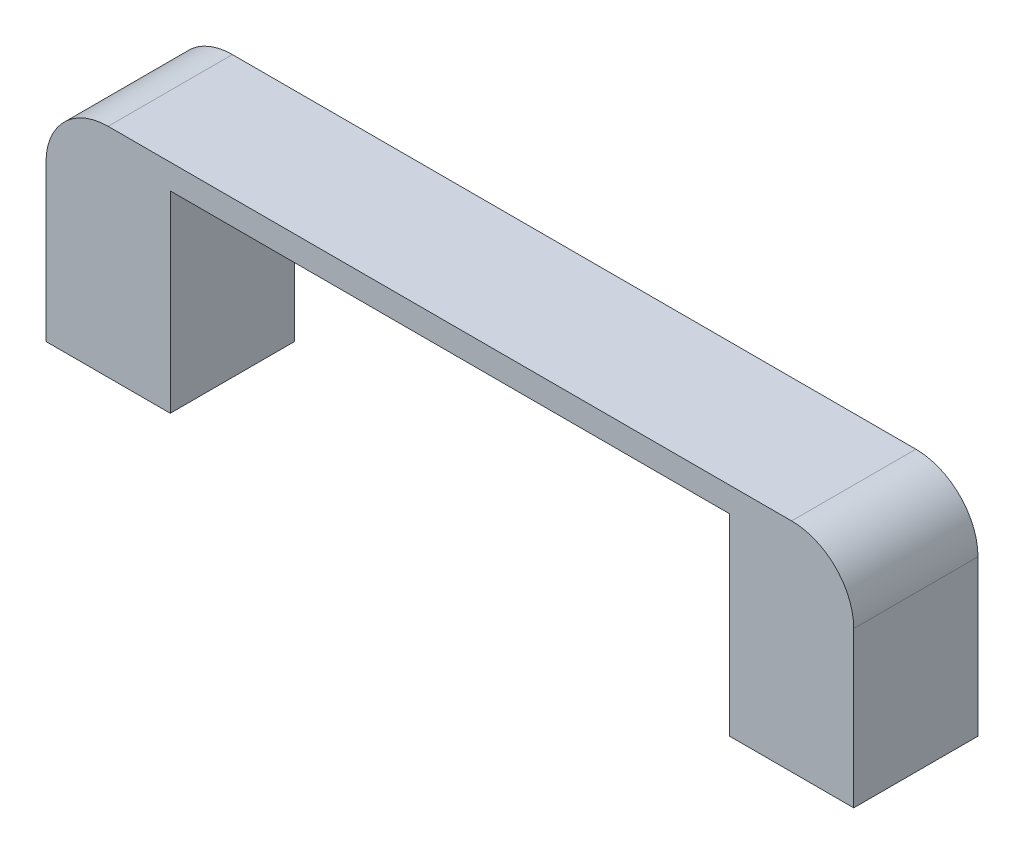
ISO-10303-21;
HEADER;
FILE_DESCRIPTION(('STEP AP214'),'2;1');
FILE_NAME('part.step','',(''),(''),'','','');
FILE_SCHEMA(('AUTOMOTIVE_DESIGN { 1 0 10303 214 1 1 1 1 }'));
ENDSEC;
DATA;
#1=APPLICATION_CONTEXT('core data for automotive mechanical design processes');
#2=APPLICATION_PROTOCOL_DEFINITION('international standard','automotive_design',2000,#1);
#3=PRODUCT_CONTEXT('',#1,'mechanical');
#4=PRODUCT('Part','Part','',(#3));
#5=PRODUCT_RELATED_PRODUCT_CATEGORY('part','',(#4));
#6=PRODUCT_DEFINITION_FORMATION('','',#4);
#7=PRODUCT_DEFINITION_CONTEXT('part definition',#1,'design');
#8=PRODUCT_DEFINITION('design','',#6,#7);
#9=PRODUCT_DEFINITION_SHAPE('','',#8);
#10=(LENGTH_UNIT() NAMED_UNIT(*) SI_UNIT(.MILLI.,.METRE.));
#11=(NAMED_UNIT(*) PLANE_ANGLE_UNIT() SI_UNIT($,.RADIAN.));
#12=(NAMED_UNIT(*) SI_UNIT($,.STERADIAN.) SOLID_ANGLE_UNIT());
#13=UNCERTAINTY_MEASURE_WITH_UNIT(LENGTH_MEASURE(1.E-05),#10,'distance_accuracy_value','');
#14=(GEOMETRIC_REPRESENTATION_CONTEXT(3) GLOBAL_UNCERTAINTY_ASSIGNED_CONTEXT((#13)) GLOBAL_UNIT_ASSIGNED_CONTEXT((#10,
#11,#12)) REPRESENTATION_CONTEXT('',''));
#15=CARTESIAN_POINT('',(0.,0.,0.));
#16=DIRECTION('',(0.,0.,1.));
#17=DIRECTION('',(1.,0.,0.));
#18=AXIS2_PLACEMENT_3D('',#15,#16,#17);
#19=CARTESIAN_POINT('',(0.,15.5,0.));
#20=DIRECTION('',(0.,-1.,0.));
#21=DIRECTION('',(0.,0.,-1.));
#22=AXIS2_PLACEMENT_3D('',#19,#20,#21);
#23=PLANE('',#22);
#24=DIRECTION('',(1.,0.,0.));
#25=VECTOR('',#24,1.);
#26=CARTESIAN_POINT('',(32.5,15.5,0.));
#27=LINE('',#26,#25);
#28=CARTESIAN_POINT('',(-22.5,15.5,0.));
#29=VERTEX_POINT('',#28);
#30=CARTESIAN_POINT('',(22.5,15.5,0.));
#31=VERTEX_POINT('',#30);
#32=EDGE_CURVE('E146',#29,#31,#27,.T.);
#33=ORIENTED_EDGE('',*,*,#32,.F.);
#34=DIRECTION('',(0.,0.,-1.));
#35=VECTOR('',#34,1.);
#36=CARTESIAN_POINT('',(-22.5,15.5,0.));
#37=LINE('',#36,#35);
#38=CARTESIAN_POINT('',(-22.5,15.5,-9.99999999999999));
#39=VERTEX_POINT('',#38);
#40=EDGE_CURVE('E140',#29,#39,#37,.T.);
#41=ORIENTED_EDGE('',*,*,#40,.T.);
#42=DIRECTION('',(-1.,0.,0.));
#43=VECTOR('',#42,1.);
#44=CARTESIAN_POINT('',(-32.5,15.5,-9.99999999999999));
#45=LINE('',#44,#43);
#46=CARTESIAN_POINT('',(22.5,15.5,-9.99999999999999));
#47=VERTEX_POINT('',#46);
#48=EDGE_CURVE('E150',#47,#39,#45,.T.);
#49=ORIENTED_EDGE('',*,*,#48,.F.);
#50=DIRECTION('',(0.,0.,1.));
#51=VECTOR('',#50,1.);
#52=CARTESIAN_POINT('',(22.5,15.5,0.));
#53=LINE('',#52,#51);
#54=EDGE_CURVE('E172',#47,#31,#53,.T.);
#55=ORIENTED_EDGE('',*,*,#54,.T.);
#56=EDGE_LOOP('',(#33,#41,#49,#55));
#57=FACE_BOUND('',#56,.T.);
#58=ADVANCED_FACE('F43',(#57),#23,.T.);
#59=CARTESIAN_POINT('',(32.5,15.5,0.));
#60=DIRECTION('',(0.,0.,-1.));
#61=DIRECTION('',(-1.,0.,0.));
#62=AXIS2_PLACEMENT_3D('',#59,#60,#61);
#63=PLANE('',#62);
#64=DIRECTION('',(0.,-1.,0.));
#65=VECTOR('',#64,1.);
#66=CARTESIAN_POINT('',(32.5,15.5,0.));
#67=LINE('',#66,#65);
#68=CARTESIAN_POINT('',(32.5,12.5,0.));
#69=VERTEX_POINT('',#68);
#70=CARTESIAN_POINT('',(32.5,0.,0.));
#71=VERTEX_POINT('',#70);
#72=EDGE_CURVE('E200',#69,#71,#67,.T.);
#73=ORIENTED_EDGE('',*,*,#72,.F.);
#74=CARTESIAN_POINT('',(27.5,12.5,0.));
#75=DIRECTION('',(0.,0.,-1.));
#76=DIRECTION('',(-1.,0.,0.));
#77=AXIS2_PLACEMENT_3D('',#74,#75,#76);
#78=CIRCLE('',#77,5.);
#79=CARTESIAN_POINT('',(27.5,17.5,0.));
#80=VERTEX_POINT('',#79);
#81=EDGE_CURVE('E52',#69,#80,#78,.F.);
#82=ORIENTED_EDGE('',*,*,#81,.T.);
#83=DIRECTION('',(1.,0.,0.));
#84=VECTOR('',#83,1.);
#85=CARTESIAN_POINT('',(32.5,17.5,0.));
#86=LINE('',#85,#84);
#87=CARTESIAN_POINT('',(-27.5,17.5,0.));
#88=VERTEX_POINT('',#87);
#89=EDGE_CURVE('E159',#88,#80,#86,.T.);
#90=ORIENTED_EDGE('',*,*,#89,.F.);
#91=CARTESIAN_POINT('',(-27.5,12.5,0.));
#92=DIRECTION('',(0.,0.,-1.));
#93=DIRECTION('',(-1.,0.,0.));
#94=AXIS2_PLACEMENT_3D('',#91,#92,#93);
#95=CIRCLE('',#94,5.);
#96=CARTESIAN_POINT('',(-32.5,12.5,0.));
#97=VERTEX_POINT('',#96);
#98=EDGE_CURVE('E59',#88,#97,#95,.F.);
#99=ORIENTED_EDGE('',*,*,#98,.T.);
#100=DIRECTION('',(0.,-1.,0.));
#101=VECTOR('',#100,1.);
#102=CARTESIAN_POINT('',(-32.5,17.5,0.));
#103=LINE('',#102,#101);
#104=CARTESIAN_POINT('',(-32.5,0.,0.));
#105=VERTEX_POINT('',#104);
#106=EDGE_CURVE('E119',#97,#105,#103,.T.);
#107=ORIENTED_EDGE('',*,*,#106,.T.);
#108=DIRECTION('',(1.,0.,0.));
#109=VECTOR('',#108,1.);
#110=CARTESIAN_POINT('',(-32.5,0.,0.));
#111=LINE('',#110,#109);
#112=CARTESIAN_POINT('',(-22.5,0.,0.));
#113=VERTEX_POINT('',#112);
#114=EDGE_CURVE('E124',#105,#113,#111,.T.);
#115=ORIENTED_EDGE('',*,*,#114,.T.);
#116=DIRECTION('',(0.,-1.,0.));
#117=VECTOR('',#116,1.);
#118=CARTESIAN_POINT('',(-22.5,15.5,0.));
#119=LINE('',#118,#117);
#120=EDGE_CURVE('E248',#29,#113,#119,.T.);
#121=ORIENTED_EDGE('',*,*,#120,.F.);
#122=ORIENTED_EDGE('',*,*,#32,.T.);
#123=DIRECTION('',(0.,-1.,0.));
#124=VECTOR('',#123,1.);
#125=CARTESIAN_POINT('',(22.5,15.5,0.));
#126=LINE('',#125,#124);
#127=CARTESIAN_POINT('',(22.5,0.,0.));
#128=VERTEX_POINT('',#127);
#129=EDGE_CURVE('E176',#31,#128,#126,.T.);
#130=ORIENTED_EDGE('',*,*,#129,.T.);
#131=DIRECTION('',(1.,0.,0.));
#132=VECTOR('',#131,1.);
#133=CARTESIAN_POINT('',(32.5,0.,0.));
#134=LINE('',#133,#132);
#135=EDGE_CURVE('E128',#128,#71,#134,.T.);
#136=ORIENTED_EDGE('',*,*,#135,.T.);
#137=EDGE_LOOP('',(#73,#82,#90,#99,#107,#115,#121,#122,#130,#136));
#138=FACE_BOUND('',#137,.T.);
#139=ADVANCED_FACE('F121',(#138),#63,.F.);
#140=CARTESIAN_POINT('',(32.5,15.5,-9.99999999999999));
#141=DIRECTION('',(-1.,0.,0.));
#142=DIRECTION('',(0.,0.,1.));
#143=AXIS2_PLACEMENT_3D('',#140,#141,#142);
#144=PLANE('',#143);
#145=DIRECTION('',(0.,-1.,0.));
#146=VECTOR('',#145,1.);
#147=CARTESIAN_POINT('',(32.5,15.5,-9.99999999999999));
#148=LINE('',#147,#146);
#149=CARTESIAN_POINT('',(32.5,12.5,-9.99999999999999));
#150=VERTEX_POINT('',#149);
#151=CARTESIAN_POINT('',(32.5,0.,-9.99999999999999));
#152=VERTEX_POINT('',#151);
#153=EDGE_CURVE('E197',#150,#152,#148,.T.);
#154=ORIENTED_EDGE('',*,*,#153,.F.);
#155=DIRECTION('',(0.,0.,-1.));
#156=VECTOR('',#155,1.);
#157=CARTESIAN_POINT('',(32.5,12.5,-9.99999999999999));
#158=LINE('',#157,#156);
#159=EDGE_CURVE('E67',#150,#69,#158,.F.);
#160=ORIENTED_EDGE('',*,*,#159,.T.);
#161=ORIENTED_EDGE('',*,*,#72,.T.);
#162=DIRECTION('',(0.,0.,-1.));
#163=VECTOR('',#162,1.);
#164=CARTESIAN_POINT('',(32.5,0.,-9.99999999999999));
#165=LINE('',#164,#163);
#166=EDGE_CURVE('E181',#71,#152,#165,.T.);
#167=ORIENTED_EDGE('',*,*,#166,.T.);
#168=EDGE_LOOP('',(#154,#160,#161,#167));
#169=FACE_BOUND('',#168,.T.);
#170=ADVANCED_FACE('F231',(#169),#144,.F.);
#171=CARTESIAN_POINT('',(22.5,15.5,-9.99999999999999));
#172=DIRECTION('',(0.,0.,1.));
#173=DIRECTION('',(1.,0.,0.));
#174=AXIS2_PLACEMENT_3D('',#171,#172,#173);
#175=PLANE('',#174);
#176=DIRECTION('',(-1.,0.,0.));
#177=VECTOR('',#176,1.);
#178=CARTESIAN_POINT('',(-32.5,17.5,-9.99999999999999));
#179=LINE('',#178,#177);
#180=CARTESIAN_POINT('',(27.5,17.5,-9.99999999999999));
#181=VERTEX_POINT('',#180);
#182=CARTESIAN_POINT('',(-27.5,17.5,-9.99999999999999));
#183=VERTEX_POINT('',#182);
#184=EDGE_CURVE('E163',#181,#183,#179,.T.);
#185=ORIENTED_EDGE('',*,*,#184,.F.);
#186=CARTESIAN_POINT('',(27.5,12.5,-9.99999999999999));
#187=DIRECTION('',(0.,0.,1.));
#188=DIRECTION('',(1.,0.,0.));
#189=AXIS2_PLACEMENT_3D('',#186,#187,#188);
#190=CIRCLE('',#189,5.);
#191=EDGE_CURVE('E214',#181,#150,#190,.F.);
#192=ORIENTED_EDGE('',*,*,#191,.T.);
#193=ORIENTED_EDGE('',*,*,#153,.T.);
#194=DIRECTION('',(-1.,0.,0.));
#195=VECTOR('',#194,1.);
#196=CARTESIAN_POINT('',(22.5,0.,-9.99999999999999));
#197=LINE('',#196,#195);
#198=CARTESIAN_POINT('',(22.5,0.,-9.99999999999999));
#199=VERTEX_POINT('',#198);
#200=EDGE_CURVE('E185',#152,#199,#197,.T.);
#201=ORIENTED_EDGE('',*,*,#200,.T.);
#202=DIRECTION('',(0.,-1.,0.));
#203=VECTOR('',#202,1.);
#204=CARTESIAN_POINT('',(22.5,15.5,-9.99999999999999));
#205=LINE('',#204,#203);
#206=EDGE_CURVE('E193',#47,#199,#205,.T.);
#207=ORIENTED_EDGE('',*,*,#206,.F.);
#208=ORIENTED_EDGE('',*,*,#48,.T.);
#209=DIRECTION('',(0.,-1.,0.));
#210=VECTOR('',#209,1.);
#211=CARTESIAN_POINT('',(-22.5,15.5,-9.99999999999999));
#212=LINE('',#211,#210);
#213=CARTESIAN_POINT('',(-22.5,0.,-9.99999999999999));
#214=VERTEX_POINT('',#213);
#215=EDGE_CURVE('E158',#39,#214,#212,.T.);
#216=ORIENTED_EDGE('',*,*,#215,.T.);
#217=DIRECTION('',(-1.,0.,0.));
#218=VECTOR('',#217,1.);
#219=CARTESIAN_POINT('',(-22.5,0.,-9.99999999999999));
#220=LINE('',#219,#218);
#221=CARTESIAN_POINT('',(-32.5,0.,-9.99999999999999));
#222=VERTEX_POINT('',#221);
#223=EDGE_CURVE('E139',#214,#222,#220,.T.);
#224=ORIENTED_EDGE('',*,*,#223,.T.);
#225=DIRECTION('',(0.,-1.,0.));
#226=VECTOR('',#225,1.);
#227=CARTESIAN_POINT('',(-32.5,17.5,-9.99999999999999));
#228=LINE('',#227,#226);
#229=CARTESIAN_POINT('',(-32.5,12.5,-9.99999999999999));
#230=VERTEX_POINT('',#229);
#231=EDGE_CURVE('E129',#230,#222,#228,.T.);
#232=ORIENTED_EDGE('',*,*,#231,.F.);
#233=CARTESIAN_POINT('',(-27.5,12.5,-9.99999999999999));
#234=DIRECTION('',(0.,0.,1.));
#235=DIRECTION('',(1.,0.,0.));
#236=AXIS2_PLACEMENT_3D('',#233,#234,#235);
#237=CIRCLE('',#236,5.);
#238=EDGE_CURVE('E211',#230,#183,#237,.F.);
#239=ORIENTED_EDGE('',*,*,#238,.T.);
#240=EDGE_LOOP('',(#185,#192,#193,#201,#207,#208,#216,#224,#232,#239));
#241=FACE_BOUND('',#240,.T.);
#242=ADVANCED_FACE('F230',(#241),#175,.F.);
#243=CARTESIAN_POINT('',(22.5,15.5,0.));
#244=DIRECTION('',(1.,0.,0.));
#245=DIRECTION('',(0.,0.,-1.));
#246=AXIS2_PLACEMENT_3D('',#243,#244,#245);
#247=PLANE('',#246);
#248=DIRECTION('',(0.,0.,1.));
#249=VECTOR('',#248,1.);
#250=CARTESIAN_POINT('',(22.5,0.,0.));
#251=LINE('',#250,#249);
#252=EDGE_CURVE('E177',#199,#128,#251,.T.);
#253=ORIENTED_EDGE('',*,*,#252,.T.);
#254=ORIENTED_EDGE('',*,*,#129,.F.);
#255=ORIENTED_EDGE('',*,*,#54,.F.);
#256=ORIENTED_EDGE('',*,*,#206,.T.);
#257=EDGE_LOOP('',(#253,#254,#255,#256));
#258=FACE_BOUND('',#257,.T.);
#259=ADVANCED_FACE('F240',(#258),#247,.F.);
#260=CARTESIAN_POINT('',(0.,0.,0.));
#261=DIRECTION('',(0.,-1.,0.));
#262=DIRECTION('',(0.,0.,-1.));
#263=AXIS2_PLACEMENT_3D('',#260,#261,#262);
#264=PLANE('',#263);
#265=CARTESIAN_POINT('',(27.5,0.,-5.));
#266=DIRECTION('',(0.,-1.,0.));
#267=DIRECTION('',(0.,0.,-1.));
#268=AXIS2_PLACEMENT_3D('',#265,#266,#267);
#269=CIRCLE('',#268,1.5);
#270=CARTESIAN_POINT('',(27.5,0.,-6.5));
#271=VERTEX_POINT('',#270);
#272=EDGE_CURVE('E259',#271,#271,#269,.T.);
#273=ORIENTED_EDGE('',*,*,#272,.F.);
#274=EDGE_LOOP('',(#273));
#275=FACE_BOUND('',#274,.T.);
#276=ORIENTED_EDGE('',*,*,#135,.F.);
#277=ORIENTED_EDGE('',*,*,#252,.F.);
#278=ORIENTED_EDGE('',*,*,#200,.F.);
#279=ORIENTED_EDGE('',*,*,#166,.F.);
#280=EDGE_LOOP('',(#276,#277,#278,#279));
#281=FACE_BOUND('',#280,.T.);
#282=ADVANCED_FACE('F237',(#275,#281),#264,.T.);
#283=CARTESIAN_POINT('',(-32.5,17.5,0.));
#284=DIRECTION('',(1.,0.,0.));
#285=DIRECTION('',(0.,0.,-1.));
#286=AXIS2_PLACEMENT_3D('',#283,#284,#285);
#287=PLANE('',#286);
#288=ORIENTED_EDGE('',*,*,#106,.F.);
#289=DIRECTION('',(0.,0.,1.));
#290=VECTOR('',#289,1.);
#291=CARTESIAN_POINT('',(-32.5,12.5,0.));
#292=LINE('',#291,#290);
#293=EDGE_CURVE('E11',#97,#230,#292,.F.);
#294=ORIENTED_EDGE('',*,*,#293,.T.);
#295=ORIENTED_EDGE('',*,*,#231,.T.);
#296=DIRECTION('',(0.,0.,1.));
#297=VECTOR('',#296,1.);
#298=CARTESIAN_POINT('',(-32.5,0.,-9.99999999999999));
#299=LINE('',#298,#297);
#300=EDGE_CURVE('E132',#222,#105,#299,.T.);
#301=ORIENTED_EDGE('',*,*,#300,.T.);
#302=EDGE_LOOP('',(#288,#294,#295,#301));
#303=FACE_BOUND('',#302,.T.);
#304=ADVANCED_FACE('F133',(#303),#287,.F.);
#305=CARTESIAN_POINT('',(0.,17.5,0.));
#306=DIRECTION('',(0.,-1.,0.));
#307=DIRECTION('',(0.,0.,-1.));
#308=AXIS2_PLACEMENT_3D('',#305,#306,#307);
#309=PLANE('',#308);
#310=ORIENTED_EDGE('',*,*,#89,.T.);
#311=DIRECTION('',(0.,0.,-1.));
#312=VECTOR('',#311,1.);
#313=CARTESIAN_POINT('',(27.5,17.5,0.));
#314=LINE('',#313,#312);
#315=EDGE_CURVE('E207',#80,#181,#314,.T.);
#316=ORIENTED_EDGE('',*,*,#315,.T.);
#317=ORIENTED_EDGE('',*,*,#184,.T.);
#318=DIRECTION('',(0.,0.,1.));
#319=VECTOR('',#318,1.);
#320=CARTESIAN_POINT('',(-27.5,17.5,0.));
#321=LINE('',#320,#319);
#322=EDGE_CURVE('E203',#183,#88,#321,.T.);
#323=ORIENTED_EDGE('',*,*,#322,.T.);
#324=EDGE_LOOP('',(#310,#316,#317,#323));
#325=FACE_BOUND('',#324,.T.);
#326=ADVANCED_FACE('F225',(#325),#309,.F.);
#327=CARTESIAN_POINT('',(-22.5,15.5,0.));
#328=DIRECTION('',(-1.,0.,0.));
#329=DIRECTION('',(0.,0.,1.));
#330=AXIS2_PLACEMENT_3D('',#327,#328,#329);
#331=PLANE('',#330);
#332=DIRECTION('',(0.,0.,-1.));
#333=VECTOR('',#332,1.);
#334=CARTESIAN_POINT('',(-22.5,0.,0.));
#335=LINE('',#334,#333);
#336=EDGE_CURVE('E143',#113,#214,#335,.T.);
#337=ORIENTED_EDGE('',*,*,#336,.T.);
#338=ORIENTED_EDGE('',*,*,#215,.F.);
#339=ORIENTED_EDGE('',*,*,#40,.F.);
#340=ORIENTED_EDGE('',*,*,#120,.T.);
#341=EDGE_LOOP('',(#337,#338,#339,#340));
#342=FACE_BOUND('',#341,.T.);
#343=ADVANCED_FACE('F280',(#342),#331,.F.);
#344=CARTESIAN_POINT('',(0.,0.,0.));
#345=DIRECTION('',(0.,1.,0.));
#346=DIRECTION('',(0.,0.,1.));
#347=AXIS2_PLACEMENT_3D('',#344,#345,#346);
#348=PLANE('',#347);
#349=CARTESIAN_POINT('',(-27.5,0.,-4.99999999999999));
#350=DIRECTION('',(0.,-1.,0.));
#351=DIRECTION('',(0.,0.,-1.));
#352=AXIS2_PLACEMENT_3D('',#349,#350,#351);
#353=CIRCLE('',#352,1.5);
#354=CARTESIAN_POINT('',(-27.5,0.,-6.5));
#355=VERTEX_POINT('',#354);
#356=EDGE_CURVE('E263',#355,#355,#353,.T.);
#357=ORIENTED_EDGE('',*,*,#356,.F.);
#358=EDGE_LOOP('',(#357));
#359=FACE_BOUND('',#358,.T.);
#360=ORIENTED_EDGE('',*,*,#114,.F.);
#361=ORIENTED_EDGE('',*,*,#300,.F.);
#362=ORIENTED_EDGE('',*,*,#223,.F.);
#363=ORIENTED_EDGE('',*,*,#336,.F.);
#364=EDGE_LOOP('',(#360,#361,#362,#363));
#365=FACE_BOUND('',#364,.T.);
#366=ADVANCED_FACE('F142',(#359,#365),#348,.F.);
#367=CARTESIAN_POINT('',(-27.5,5.,-4.99999999999999));
#368=DIRECTION('',(0.,-1.,0.));
#369=DIRECTION('',(0.,0.,-1.));
#370=AXIS2_PLACEMENT_3D('',#367,#368,#369);
#371=CYLINDRICAL_SURFACE('',#370,1.5);
#372=CARTESIAN_POINT('',(-27.5,5.,-4.99999999999999));
#373=DIRECTION('',(0.,-1.,0.));
#374=DIRECTION('',(0.,0.,-1.));
#375=AXIS2_PLACEMENT_3D('',#372,#373,#374);
#376=CIRCLE('',#375,1.5);
#377=CARTESIAN_POINT('',(-27.5,5.,-6.5));
#378=VERTEX_POINT('',#377);
#379=EDGE_CURVE('E254',#378,#378,#376,.T.);
#380=ORIENTED_EDGE('',*,*,#379,.F.);
#381=EDGE_LOOP('',(#380));
#382=FACE_BOUND('',#381,.T.);
#383=ORIENTED_EDGE('',*,*,#356,.T.);
#384=EDGE_LOOP('',(#383));
#385=FACE_BOUND('',#384,.T.);
#386=ADVANCED_FACE('F273',(#382,#385),#371,.F.);
#387=CARTESIAN_POINT('',(-27.5,5.,-4.99999999999999));
#388=DIRECTION('',(0.,-1.,0.));
#389=DIRECTION('',(0.,0.,-1.));
#390=AXIS2_PLACEMENT_3D('',#387,#388,#389);
#391=PLANE('',#390);
#392=ORIENTED_EDGE('',*,*,#379,.T.);
#393=EDGE_LOOP('',(#392));
#394=FACE_BOUND('',#393,.T.);
#395=ADVANCED_FACE('F271',(#394),#391,.T.);
#396=CARTESIAN_POINT('',(27.5,5.,-5.));
#397=DIRECTION('',(0.,-1.,0.));
#398=DIRECTION('',(0.,0.,-1.));
#399=AXIS2_PLACEMENT_3D('',#396,#397,#398);
#400=CYLINDRICAL_SURFACE('',#399,1.5);
#401=CARTESIAN_POINT('',(27.5,5.,-5.));
#402=DIRECTION('',(0.,-1.,0.));
#403=DIRECTION('',(0.,0.,-1.));
#404=AXIS2_PLACEMENT_3D('',#401,#402,#403);
#405=CIRCLE('',#404,1.5);
#406=CARTESIAN_POINT('',(27.5,5.,-6.5));
#407=VERTEX_POINT('',#406);
#408=EDGE_CURVE('E255',#407,#407,#405,.T.);
#409=ORIENTED_EDGE('',*,*,#408,.F.);
#410=EDGE_LOOP('',(#409));
#411=FACE_BOUND('',#410,.T.);
#412=ORIENTED_EDGE('',*,*,#272,.T.);
#413=EDGE_LOOP('',(#412));
#414=FACE_BOUND('',#413,.T.);
#415=ADVANCED_FACE('F311',(#411,#414),#400,.F.);
#416=CARTESIAN_POINT('',(27.5,5.,-5.));
#417=DIRECTION('',(0.,-1.,0.));
#418=DIRECTION('',(0.,0.,-1.));
#419=AXIS2_PLACEMENT_3D('',#416,#417,#418);
#420=PLANE('',#419);
#421=ORIENTED_EDGE('',*,*,#408,.T.);
#422=EDGE_LOOP('',(#421));
#423=FACE_BOUND('',#422,.T.);
#424=ADVANCED_FACE('F305',(#423),#420,.T.);
#425=CARTESIAN_POINT('',(27.5,12.5,0.));
#426=DIRECTION('',(0.,0.,-1.));
#427=DIRECTION('',(-1.,0.,0.));
#428=AXIS2_PLACEMENT_3D('',#425,#426,#427);
#429=CYLINDRICAL_SURFACE('',#428,5.);
#430=ORIENTED_EDGE('',*,*,#81,.F.);
#431=ORIENTED_EDGE('',*,*,#159,.F.);
#432=ORIENTED_EDGE('',*,*,#191,.F.);
#433=ORIENTED_EDGE('',*,*,#315,.F.);
#434=EDGE_LOOP('',(#430,#431,#432,#433));
#435=FACE_BOUND('',#434,.T.);
#436=ADVANCED_FACE('F228',(#435),#429,.T.);
#437=CARTESIAN_POINT('',(-27.5,12.5,0.));
#438=DIRECTION('',(0.,0.,1.));
#439=DIRECTION('',(1.,0.,0.));
#440=AXIS2_PLACEMENT_3D('',#437,#438,#439);
#441=CYLINDRICAL_SURFACE('',#440,5.);
#442=ORIENTED_EDGE('',*,*,#238,.F.);
#443=ORIENTED_EDGE('',*,*,#293,.F.);
#444=ORIENTED_EDGE('',*,*,#98,.F.);
#445=ORIENTED_EDGE('',*,*,#322,.F.);
#446=EDGE_LOOP('',(#442,#443,#444,#445));
#447=FACE_BOUND('',#446,.T.);
#448=ADVANCED_FACE('F45',(#447),#441,.T.);
#449=CLOSED_SHELL('',(#58,#139,#170,#242,#259,#282,#304,#326,#343,#366,#386,#395,#415,#424,#436,#448));
#450=MANIFOLD_SOLID_BREP('B2',#449);
#451=ADVANCED_BREP_SHAPE_REPRESENTATION('',(#18,#450),#14);
#452=SHAPE_DEFINITION_REPRESENTATION(#9,#451);
ENDSEC;
END-ISO-10303-21;
